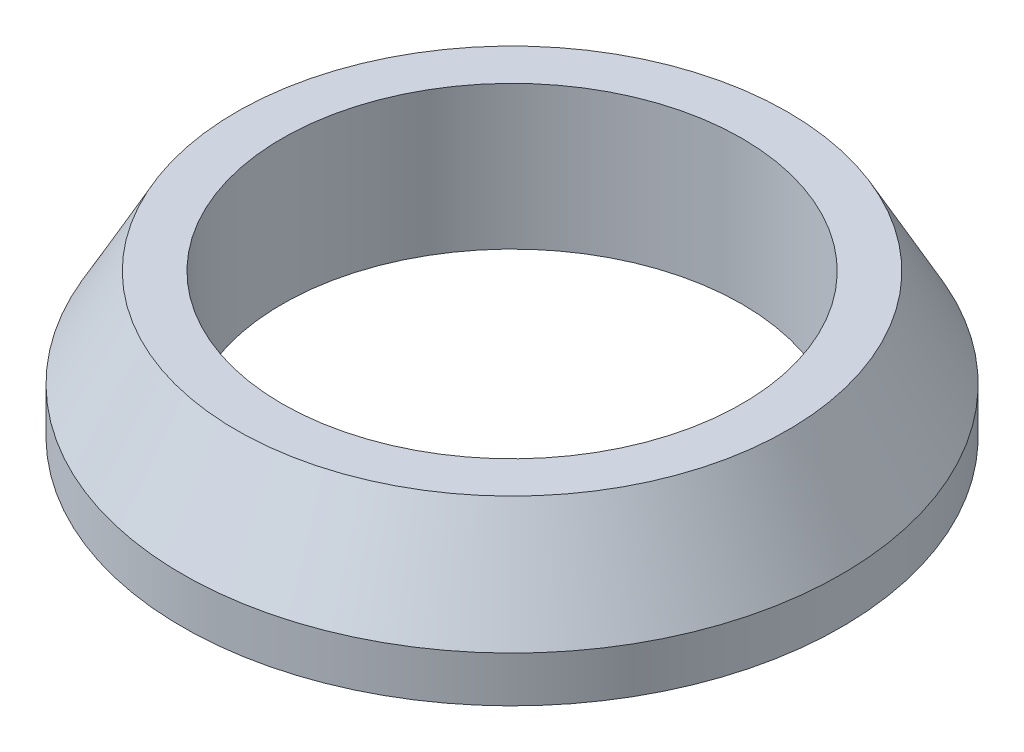
ISO-10303-21;
HEADER;
FILE_DESCRIPTION(('STEP AP214'),'2;1');
FILE_NAME('part.step','',(''),(''),'','','');
FILE_SCHEMA(('AUTOMOTIVE_DESIGN { 1 0 10303 214 1 1 1 1 }'));
ENDSEC;
DATA;
#1=APPLICATION_CONTEXT('core data for automotive mechanical design processes');
#2=APPLICATION_PROTOCOL_DEFINITION('international standard','automotive_design',2000,#1);
#3=PRODUCT_CONTEXT('',#1,'mechanical');
#4=PRODUCT('Part','Part','',(#3));
#5=PRODUCT_RELATED_PRODUCT_CATEGORY('part','',(#4));
#6=PRODUCT_DEFINITION_FORMATION('','',#4);
#7=PRODUCT_DEFINITION_CONTEXT('part definition',#1,'design');
#8=PRODUCT_DEFINITION('design','',#6,#7);
#9=PRODUCT_DEFINITION_SHAPE('','',#8);
#10=(LENGTH_UNIT() NAMED_UNIT(*) SI_UNIT(.MILLI.,.METRE.));
#11=(NAMED_UNIT(*) PLANE_ANGLE_UNIT() SI_UNIT($,.RADIAN.));
#12=(NAMED_UNIT(*) SI_UNIT($,.STERADIAN.) SOLID_ANGLE_UNIT());
#13=UNCERTAINTY_MEASURE_WITH_UNIT(LENGTH_MEASURE(1.E-05),#10,'distance_accuracy_value','');
#14=(GEOMETRIC_REPRESENTATION_CONTEXT(3) GLOBAL_UNCERTAINTY_ASSIGNED_CONTEXT((#13)) GLOBAL_UNIT_ASSIGNED_CONTEXT((#10,
#11,#12)) REPRESENTATION_CONTEXT('',''));
#15=CARTESIAN_POINT('',(0.,0.,0.));
#16=DIRECTION('',(0.,0.,1.));
#17=DIRECTION('',(1.,0.,0.));
#18=AXIS2_PLACEMENT_3D('',#15,#16,#17);
#19=CARTESIAN_POINT('',(0.,0.,0.));
#20=DIRECTION('',(0.,-1.,0.));
#21=DIRECTION('',(0.,0.,-1.));
#22=AXIS2_PLACEMENT_3D('',#19,#20,#21);
#23=CYLINDRICAL_SURFACE('',#22,6.3881);
#24=CARTESIAN_POINT('',(0.,0.,0.));
#25=DIRECTION('',(0.,-1.,0.));
#26=DIRECTION('',(0.,0.,-1.));
#27=AXIS2_PLACEMENT_3D('',#24,#25,#26);
#28=CIRCLE('',#27,6.3881);
#29=CARTESIAN_POINT('',(0.,0.,-6.3881));
#30=VERTEX_POINT('',#29);
#31=EDGE_CURVE('E10',#30,#30,#28,.T.);
#32=ORIENTED_EDGE('',*,*,#31,.T.);
#33=EDGE_LOOP('',(#32));
#34=FACE_BOUND('',#33,.T.);
#35=CARTESIAN_POINT('',(0.,3.9878,0.));
#36=DIRECTION('',(0.,-1.,0.));
#37=DIRECTION('',(0.,0.,-1.));
#38=AXIS2_PLACEMENT_3D('',#35,#36,#37);
#39=CIRCLE('',#38,6.3881);
#40=CARTESIAN_POINT('',(0.,3.9878,-6.3881));
#41=VERTEX_POINT('',#40);
#42=EDGE_CURVE('E50',#41,#41,#39,.T.);
#43=ORIENTED_EDGE('',*,*,#42,.F.);
#44=EDGE_LOOP('',(#43));
#45=FACE_BOUND('',#44,.T.);
#46=ADVANCED_FACE('F31',(#34,#45),#23,.F.);
#47=CARTESIAN_POINT('',(6.3881,0.,0.));
#48=DIRECTION('',(0.,-1.,0.));
#49=DIRECTION('',(0.,0.,-1.));
#50=AXIS2_PLACEMENT_3D('',#47,#48,#49);
#51=PLANE('',#50);
#52=CARTESIAN_POINT('',(0.,0.,0.));
#53=DIRECTION('',(0.,-1.,0.));
#54=DIRECTION('',(0.,0.,-1.));
#55=AXIS2_PLACEMENT_3D('',#52,#53,#54);
#56=CIRCLE('',#55,9.1567);
#57=CARTESIAN_POINT('',(0.,0.,-9.1567));
#58=VERTEX_POINT('',#57);
#59=EDGE_CURVE('E37',#58,#58,#56,.T.);
#60=ORIENTED_EDGE('',*,*,#59,.T.);
#61=EDGE_LOOP('',(#60));
#62=FACE_BOUND('',#61,.T.);
#63=ORIENTED_EDGE('',*,*,#31,.F.);
#64=EDGE_LOOP('',(#63));
#65=FACE_BOUND('',#64,.T.);
#66=ADVANCED_FACE('F58',(#62,#65),#51,.T.);
#67=CARTESIAN_POINT('',(0.,0.,0.));
#68=DIRECTION('',(0.,-1.,0.));
#69=DIRECTION('',(0.,0.,-1.));
#70=AXIS2_PLACEMENT_3D('',#67,#68,#69);
#71=CYLINDRICAL_SURFACE('',#70,9.1567);
#72=CARTESIAN_POINT('',(0.,1.27,0.));
#73=DIRECTION('',(0.,-1.,0.));
#74=DIRECTION('',(0.,0.,-1.));
#75=AXIS2_PLACEMENT_3D('',#72,#73,#74);
#76=CIRCLE('',#75,9.1567);
#77=CARTESIAN_POINT('',(0.,1.27,-9.1567));
#78=VERTEX_POINT('',#77);
#79=EDGE_CURVE('E41',#78,#78,#76,.T.);
#80=ORIENTED_EDGE('',*,*,#79,.T.);
#81=EDGE_LOOP('',(#80));
#82=FACE_BOUND('',#81,.T.);
#83=ORIENTED_EDGE('',*,*,#59,.F.);
#84=EDGE_LOOP('',(#83));
#85=FACE_BOUND('',#84,.T.);
#86=ADVANCED_FACE('F62',(#82,#85),#71,.T.);
#87=CARTESIAN_POINT('',(0.,1.27,0.));
#88=DIRECTION('',(0.,-1.,0.));
#89=DIRECTION('',(0.,0.,-1.));
#90=AXIS2_PLACEMENT_3D('',#87,#88,#89);
#91=CONICAL_SURFACE('',#90,9.1567,0.503918864869406);
#92=CARTESIAN_POINT('',(0.,3.9878,0.));
#93=DIRECTION('',(0.,-1.,0.));
#94=DIRECTION('',(0.,0.,-1.));
#95=AXIS2_PLACEMENT_3D('',#92,#93,#94);
#96=CIRCLE('',#95,7.6581);
#97=CARTESIAN_POINT('',(0.,3.9878,-7.6581));
#98=VERTEX_POINT('',#97);
#99=EDGE_CURVE('E45',#98,#98,#96,.T.);
#100=ORIENTED_EDGE('',*,*,#99,.T.);
#101=EDGE_LOOP('',(#100));
#102=FACE_BOUND('',#101,.T.);
#103=ORIENTED_EDGE('',*,*,#79,.F.);
#104=EDGE_LOOP('',(#103));
#105=FACE_BOUND('',#104,.T.);
#106=ADVANCED_FACE('F66',(#102,#105),#91,.T.);
#107=CARTESIAN_POINT('',(7.6581,3.9878,0.));
#108=DIRECTION('',(0.,1.,0.));
#109=DIRECTION('',(0.,0.,1.));
#110=AXIS2_PLACEMENT_3D('',#107,#108,#109);
#111=PLANE('',#110);
#112=ORIENTED_EDGE('',*,*,#42,.T.);
#113=EDGE_LOOP('',(#112));
#114=FACE_BOUND('',#113,.T.);
#115=ORIENTED_EDGE('',*,*,#99,.F.);
#116=EDGE_LOOP('',(#115));
#117=FACE_BOUND('',#116,.T.);
#118=ADVANCED_FACE('F54',(#114,#117),#111,.T.);
#119=CLOSED_SHELL('',(#46,#66,#86,#106,#118));
#120=MANIFOLD_SOLID_BREP('B2',#119);
#121=ADVANCED_BREP_SHAPE_REPRESENTATION('',(#18,#120),#14);
#122=SHAPE_DEFINITION_REPRESENTATION(#9,#121);
ENDSEC;
END-ISO-10303-21;
